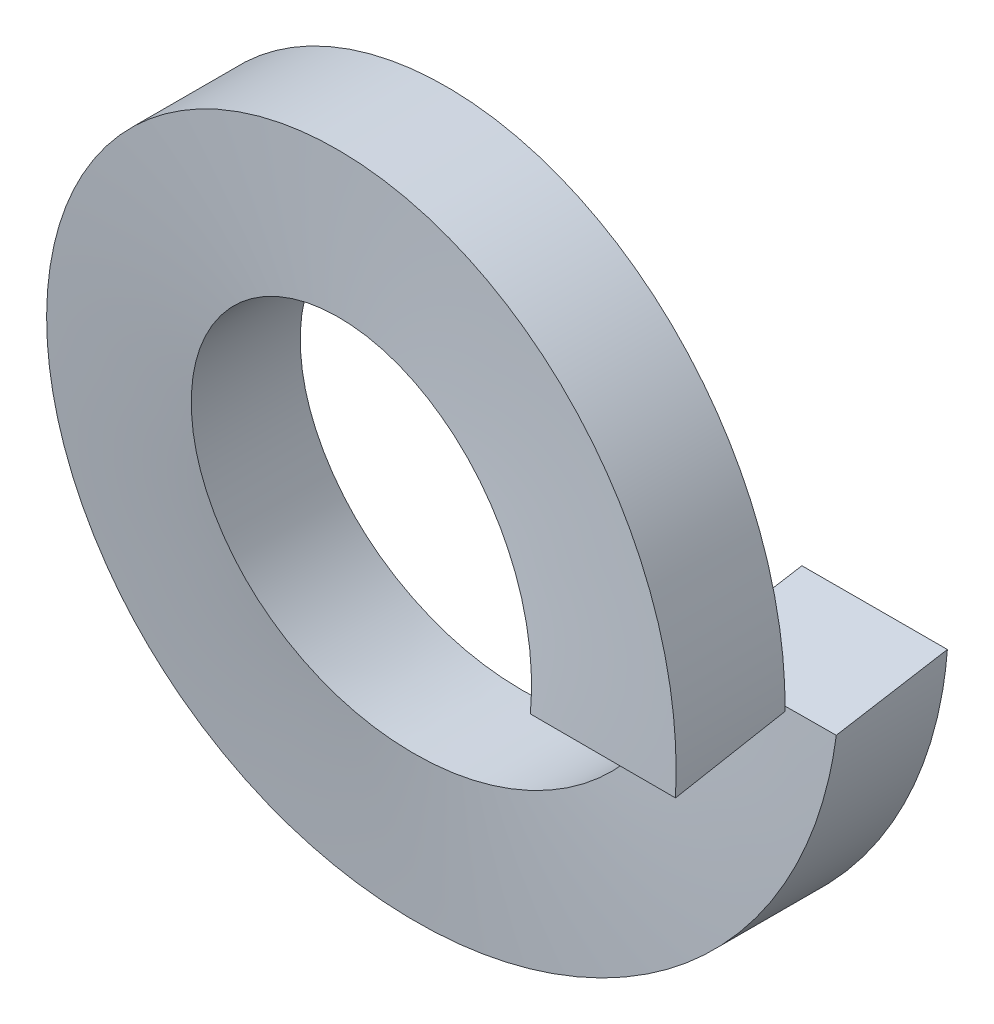
ISO-10303-21;
HEADER;
FILE_DESCRIPTION(('STEP AP214'),'2;1');
FILE_NAME('part.step','',(''),(''),'','','');
FILE_SCHEMA(('AUTOMOTIVE_DESIGN { 1 0 10303 214 1 1 1 1 }'));
ENDSEC;
DATA;
#1=APPLICATION_CONTEXT('core data for automotive mechanical design processes');
#2=APPLICATION_PROTOCOL_DEFINITION('international standard','automotive_design',2000,#1);
#3=PRODUCT_CONTEXT('',#1,'mechanical');
#4=PRODUCT('Part','Part','',(#3));
#5=PRODUCT_RELATED_PRODUCT_CATEGORY('part','',(#4));
#6=PRODUCT_DEFINITION_FORMATION('','',#4);
#7=PRODUCT_DEFINITION_CONTEXT('part definition',#1,'design');
#8=PRODUCT_DEFINITION('design','',#6,#7);
#9=PRODUCT_DEFINITION_SHAPE('','',#8);
#10=(LENGTH_UNIT() NAMED_UNIT(*) SI_UNIT(.MILLI.,.METRE.));
#11=(NAMED_UNIT(*) PLANE_ANGLE_UNIT() SI_UNIT($,.RADIAN.));
#12=(NAMED_UNIT(*) SI_UNIT($,.STERADIAN.) SOLID_ANGLE_UNIT());
#13=UNCERTAINTY_MEASURE_WITH_UNIT(LENGTH_MEASURE(1.E-05),#10,'distance_accuracy_value','');
#14=(GEOMETRIC_REPRESENTATION_CONTEXT(3) GLOBAL_UNCERTAINTY_ASSIGNED_CONTEXT((#13)) GLOBAL_UNIT_ASSIGNED_CONTEXT((#10,
#11,#12)) REPRESENTATION_CONTEXT('',''));
#15=CARTESIAN_POINT('',(0.,0.,0.));
#16=DIRECTION('',(0.,0.,1.));
#17=DIRECTION('',(1.,0.,0.));
#18=AXIS2_PLACEMENT_3D('',#15,#16,#17);
#19=CARTESIAN_POINT('',(5.765,0.,0.749999999999999));
#20=CARTESIAN_POINT('',(5.765,1.54472709436542,0.562499999999999));
#21=CARTESIAN_POINT('',(4.99263645281729,2.8825,0.374999999999999));
#22=CARTESIAN_POINT('',(4.22027290563458,4.22027290563458,0.187499999999999));
#23=CARTESIAN_POINT('',(2.8825,4.99263645281729,0.));
#24=CARTESIAN_POINT('',(1.54472709436542,5.765,-0.187500000000001));
#25=CARTESIAN_POINT('',(0.,5.765,-0.375000000000001));
#26=CARTESIAN_POINT('',(-1.54472709436542,5.765,-0.562500000000001));
#27=CARTESIAN_POINT('',(-2.8825,4.99263645281729,-0.750000000000001));
#28=CARTESIAN_POINT('',(-4.22027290563458,4.22027290563458,-0.937500000000001));
#29=CARTESIAN_POINT('',(-4.99263645281729,2.8825,-1.125));
#30=CARTESIAN_POINT('',(-5.765,1.54472709436542,-1.3125));
#31=CARTESIAN_POINT('',(-5.765,0.,-1.5));
#32=CARTESIAN_POINT('',(-5.765,-1.54472709436542,-1.6875));
#33=CARTESIAN_POINT('',(-4.99263645281729,-2.8825,-1.875));
#34=CARTESIAN_POINT('',(-4.22027290563458,-4.22027290563457,-2.0625));
#35=CARTESIAN_POINT('',(-2.8825,-4.99263645281729,-2.25));
#36=CARTESIAN_POINT('',(-1.54472709436543,-5.765,-2.4375));
#37=CARTESIAN_POINT('',(0.,-5.765,-2.625));
#38=CARTESIAN_POINT('',(1.54472709436542,-5.765,-2.8125));
#39=CARTESIAN_POINT('',(2.8825,-4.99263645281729,-3.));
#40=CARTESIAN_POINT('',(4.22027290563458,-4.22027290563458,-3.1875));
#41=CARTESIAN_POINT('',(4.99263645281729,-2.8825,-3.375));
#42=CARTESIAN_POINT('',(5.765,-1.54472709436543,-3.5625));
#43=CARTESIAN_POINT('',(5.765,0.,-3.75));
#44=CARTESIAN_POINT('',(5.765,0.,3.75));
#45=CARTESIAN_POINT('',(5.765,1.54472709436542,3.5625));
#46=CARTESIAN_POINT('',(4.99263645281729,2.8825,3.375));
#47=CARTESIAN_POINT('',(4.22027290563458,4.22027290563458,3.1875));
#48=CARTESIAN_POINT('',(2.8825,4.99263645281729,3.));
#49=CARTESIAN_POINT('',(1.54472709436542,5.765,2.8125));
#50=CARTESIAN_POINT('',(0.,5.765,2.625));
#51=CARTESIAN_POINT('',(-1.54472709436542,5.765,2.4375));
#52=CARTESIAN_POINT('',(-2.8825,4.99263645281729,2.25));
#53=CARTESIAN_POINT('',(-4.22027290563458,4.22027290563458,2.0625));
#54=CARTESIAN_POINT('',(-4.99263645281729,2.8825,1.875));
#55=CARTESIAN_POINT('',(-5.765,1.54472709436542,1.6875));
#56=CARTESIAN_POINT('',(-5.765,0.,1.5));
#57=CARTESIAN_POINT('',(-5.765,-1.54472709436542,1.3125));
#58=CARTESIAN_POINT('',(-4.99263645281729,-2.8825,1.125));
#59=CARTESIAN_POINT('',(-4.22027290563458,-4.22027290563457,0.9375));
#60=CARTESIAN_POINT('',(-2.8825,-4.99263645281729,0.749999999999999));
#61=CARTESIAN_POINT('',(-1.54472709436543,-5.765,0.562499999999999));
#62=CARTESIAN_POINT('',(0.,-5.765,0.374999999999999));
#63=CARTESIAN_POINT('',(1.54472709436542,-5.765,0.187499999999999));
#64=CARTESIAN_POINT('',(2.8825,-4.99263645281729,0.));
#65=CARTESIAN_POINT('',(4.22027290563458,-4.22027290563458,-0.1875));
#66=CARTESIAN_POINT('',(4.99263645281729,-2.8825,-0.375));
#67=CARTESIAN_POINT('',(5.765,-1.54472709436543,-0.5625));
#68=CARTESIAN_POINT('',(5.765,0.,-0.750000000000001));
#69=(BOUNDED_SURFACE() B_SPLINE_SURFACE(1,2,((#19,#20,#21,#22,#23,#24,#25,#26,#27,#28,#29,#30,
#31,#32,#33,#34,#35,#36,#37,#38,#39,#40,#41,#42,#43),(#44,#45,#46,#47,#48,#49,#50,#51,#52,#53,
#54,#55,#56,#57,#58,#59,#60,#61,#62,#63,#64,#65,#66,#67,#68)),.UNSPECIFIED.,.F.,.F.,
.F.) B_SPLINE_SURFACE_WITH_KNOTS((2,2),(3,2,2,2,2,2,2,2,2,2,2,2,3),(0.,1.),(0.,
0.0833333333333333,0.166666666666667,0.25,0.333333333333333,0.416666666666667,0.5,
0.583333333333333,0.666666666666667,0.75,0.833333333333333,0.916666666666667,1.),
.UNSPECIFIED.) GEOMETRIC_REPRESENTATION_ITEM() RATIONAL_B_SPLINE_SURFACE(((1.,0.965925826289068,
1.,0.965925826289068,1.,0.965925826289068,1.,0.965925826289068,1.,0.965925826289068,1.,
0.965925826289068,1.,0.965925826289068,1.,0.965925826289068,1.,0.965925826289068,1.,
0.965925826289068,1.,0.965925826289068,1.,0.965925826289068,1.),(1.,0.965925826289068,1.,
0.965925826289068,1.,0.965925826289068,1.,0.965925826289068,1.,0.965925826289068,1.,
0.965925826289068,1.,0.965925826289068,1.,0.965925826289068,1.,0.965925826289068,1.,
0.965925826289068,1.,0.965925826289068,1.,0.965925826289068,1.))) REPRESENTATION_ITEM('') SURFACE());
#70=CARTESIAN_POINT('',(5.765,0.,3.75));
#71=CARTESIAN_POINT('',(5.765,1.54472709436542,3.5625));
#72=CARTESIAN_POINT('',(4.99263645281729,2.8825,3.375));
#73=CARTESIAN_POINT('',(4.22027290563458,4.22027290563458,3.1875));
#74=CARTESIAN_POINT('',(2.8825,4.99263645281729,3.));
#75=CARTESIAN_POINT('',(1.54472709436542,5.765,2.8125));
#76=CARTESIAN_POINT('',(0.,5.765,2.625));
#77=CARTESIAN_POINT('',(-1.54472709436542,5.765,2.4375));
#78=CARTESIAN_POINT('',(-2.8825,4.99263645281729,2.25));
#79=CARTESIAN_POINT('',(-4.22027290563458,4.22027290563458,2.0625));
#80=CARTESIAN_POINT('',(-4.99263645281729,2.8825,1.875));
#81=CARTESIAN_POINT('',(-5.765,1.54472709436542,1.6875));
#82=CARTESIAN_POINT('',(-5.765,0.,1.5));
#83=CARTESIAN_POINT('',(-5.765,-1.54472709436542,1.3125));
#84=CARTESIAN_POINT('',(-4.99263645281729,-2.8825,1.125));
#85=CARTESIAN_POINT('',(-4.22027290563458,-4.22027290563457,0.9375));
#86=CARTESIAN_POINT('',(-2.8825,-4.99263645281729,0.749999999999999));
#87=CARTESIAN_POINT('',(-1.54472709436543,-5.765,0.562499999999999));
#88=CARTESIAN_POINT('',(0.,-5.765,0.374999999999999));
#89=CARTESIAN_POINT('',(1.54472709436542,-5.765,0.187499999999999));
#90=CARTESIAN_POINT('',(2.8825,-4.99263645281729,0.));
#91=CARTESIAN_POINT('',(4.22027290563458,-4.22027290563458,-0.1875));
#92=CARTESIAN_POINT('',(4.99263645281729,-2.8825,-0.375));
#93=CARTESIAN_POINT('',(5.765,-1.54472709436543,-0.5625));
#94=CARTESIAN_POINT('',(5.765,0.,-0.750000000000001));
#95=(BOUNDED_CURVE() B_SPLINE_CURVE(2,(#70,#71,#72,#73,#74,#75,#76,#77,#78,#79,#80,#81,#82,#83,
#84,#85,#86,#87,#88,#89,#90,#91,#92,#93,#94),.UNSPECIFIED.,.F.,
.F.) B_SPLINE_CURVE_WITH_KNOTS((3,2,2,2,2,2,2,2,2,2,2,2,3),(0.,0.0833333333333333,
0.166666666666667,0.25,0.333333333333333,0.416666666666667,0.5,0.583333333333333,
0.666666666666667,0.75,0.833333333333333,0.916666666666667,1.),
.UNSPECIFIED.) CURVE() GEOMETRIC_REPRESENTATION_ITEM() RATIONAL_B_SPLINE_CURVE((1.,
0.965925826289068,1.,0.965925826289068,1.,0.965925826289068,1.,0.965925826289068,1.,
0.965925826289068,1.,0.965925826289068,1.,0.965925826289068,1.,0.965925826289068,1.,
0.965925826289068,1.,0.965925826289068,1.,0.965925826289068,1.,0.965925826289068,1.)) REPRESENTATION_ITEM(''));
#96=CARTESIAN_POINT('',(5.76408794042053,0.102543722863248,3.73752351116753));
#97=VERTEX_POINT('',#96);
#98=CARTESIAN_POINT('',(5.72899561014913,-0.643299540565697,-0.670744873382662));
#99=VERTEX_POINT('',#98);
#100=EDGE_CURVE('E95',#97,#99,#95,.T.);
#101=CARTESIAN_POINT('',(5.7289956101492,-0.643299540565049,-0.670744873382743));
#102=CARTESIAN_POINT('',(5.73911074554524,-0.553186752426223,-1.18179989046955));
#103=CARTESIAN_POINT('',(5.74708132428222,-0.463067032184314,-1.69289422146653));
#104=CARTESIAN_POINT('',(5.75584601051134,-0.327878589746962,-2.45958597728393));
#105=CARTESIAN_POINT('',(5.7582357332344,-0.282812919540643,-2.71516609341392));
#106=CARTESIAN_POINT('',(5.7619555391141,-0.192679507763275,-3.22633807296703));
#107=CARTESIAN_POINT('',(5.76328560458463,-0.147611766170208,-3.48192993651502));
#108=CARTESIAN_POINT('',(5.76408794042052,-0.102543722863249,-3.73752351116753));
#109=B_SPLINE_CURVE_WITH_KNOTS('',3,(#101,#102,#103,#104,#105,#106,#107,#108),.UNSPECIFIED.,.F.,
.F.,(4,2,2,4),(0.,1.55710374206691,2.33570326149786,3.11431577579177),.UNSPECIFIED.);
#110=CARTESIAN_POINT('',(5.76408794042052,-0.102543722863246,-3.73752351116753));
#111=VERTEX_POINT('',#110);
#112=EDGE_CURVE('E61',#99,#111,#109,.T.);
#113=CARTESIAN_POINT('',(5.765,0.,0.749999999999999));
#114=CARTESIAN_POINT('',(5.765,1.54472709436542,0.562499999999999));
#115=CARTESIAN_POINT('',(4.99263645281729,2.8825,0.374999999999999));
#116=CARTESIAN_POINT('',(4.22027290563458,4.22027290563458,0.187499999999999));
#117=CARTESIAN_POINT('',(2.8825,4.99263645281729,0.));
#118=CARTESIAN_POINT('',(1.54472709436542,5.765,-0.187500000000001));
#119=CARTESIAN_POINT('',(0.,5.765,-0.375000000000001));
#120=CARTESIAN_POINT('',(-1.54472709436542,5.765,-0.562500000000001));
#121=CARTESIAN_POINT('',(-2.8825,4.99263645281729,-0.750000000000001));
#122=CARTESIAN_POINT('',(-4.22027290563458,4.22027290563458,-0.937500000000001));
#123=CARTESIAN_POINT('',(-4.99263645281729,2.8825,-1.125));
#124=CARTESIAN_POINT('',(-5.765,1.54472709436542,-1.3125));
#125=CARTESIAN_POINT('',(-5.765,0.,-1.5));
#126=CARTESIAN_POINT('',(-5.765,-1.54472709436542,-1.6875));
#127=CARTESIAN_POINT('',(-4.99263645281729,-2.8825,-1.875));
#128=CARTESIAN_POINT('',(-4.22027290563458,-4.22027290563457,-2.0625));
#129=CARTESIAN_POINT('',(-2.8825,-4.99263645281729,-2.25));
#130=CARTESIAN_POINT('',(-1.54472709436543,-5.765,-2.4375));
#131=CARTESIAN_POINT('',(0.,-5.765,-2.625));
#132=CARTESIAN_POINT('',(1.54472709436542,-5.765,-2.8125));
#133=CARTESIAN_POINT('',(2.8825,-4.99263645281729,-3.));
#134=CARTESIAN_POINT('',(4.22027290563458,-4.22027290563458,-3.1875));
#135=CARTESIAN_POINT('',(4.99263645281729,-2.8825,-3.375));
#136=CARTESIAN_POINT('',(5.765,-1.54472709436543,-3.5625));
#137=CARTESIAN_POINT('',(5.765,0.,-3.75));
#138=(BOUNDED_CURVE() B_SPLINE_CURVE(2,(#113,#114,#115,#116,#117,#118,#119,#120,#121,#122,#123,
#124,#125,#126,#127,#128,#129,#130,#131,#132,#133,#134,#135,#136,#137),.UNSPECIFIED.,.F.,
.F.) B_SPLINE_CURVE_WITH_KNOTS((3,2,2,2,2,2,2,2,2,2,2,2,3),(0.,0.0833333333333333,
0.166666666666667,0.25,0.333333333333333,0.416666666666667,0.5,0.583333333333333,
0.666666666666667,0.75,0.833333333333333,0.916666666666667,1.),
.UNSPECIFIED.) CURVE() GEOMETRIC_REPRESENTATION_ITEM() RATIONAL_B_SPLINE_CURVE((1.,
0.965925826289068,1.,0.965925826289068,1.,0.965925826289068,1.,0.965925826289068,1.,
0.965925826289068,1.,0.965925826289068,1.,0.965925826289068,1.,0.965925826289068,1.,
0.965925826289068,1.,0.965925826289068,1.,0.965925826289068,1.,0.965925826289068,1.)) REPRESENTATION_ITEM(''));
#139=CARTESIAN_POINT('',(5.7289956101492,0.64329954056505,0.670744873382741));
#140=VERTEX_POINT('',#139);
#141=EDGE_CURVE('E91',#140,#111,#138,.T.);
#142=CARTESIAN_POINT('',(5.7289956101492,0.64329954056505,0.670744873382741));
#143=CARTESIAN_POINT('',(5.73911074554524,0.553186752426222,1.18179989046955));
#144=CARTESIAN_POINT('',(5.74708132428223,0.463067032184313,1.69289422146653));
#145=CARTESIAN_POINT('',(5.75584601051134,0.327878589746962,2.45958597728393));
#146=CARTESIAN_POINT('',(5.7582357332344,0.282812919540643,2.71516609341392));
#147=CARTESIAN_POINT('',(5.7619555391141,0.192679507763275,3.22633807296703));
#148=CARTESIAN_POINT('',(5.76328560458463,0.147611766170208,3.48192993651502));
#149=CARTESIAN_POINT('',(5.76408794042053,0.102543722863248,3.73752351116753));
#150=B_SPLINE_CURVE_WITH_KNOTS('',3,(#142,#143,#144,#145,#146,#147,#148,#149),.UNSPECIFIED.,.F.,
.F.,(4,2,2,4),(0.,1.55710374206691,2.33570326149787,3.11431577579177),.UNSPECIFIED.);
#151=EDGE_CURVE('E85',#140,#97,#150,.T.);
#152=ORIENTED_EDGE('',*,*,#100,.T.);
#153=ORIENTED_EDGE('',*,*,#112,.T.);
#154=ORIENTED_EDGE('',*,*,#141,.F.);
#155=ORIENTED_EDGE('',*,*,#151,.T.);
#156=EDGE_LOOP('',(#152,#153,#154,#155));
#157=FACE_BOUND('',#156,.T.);
#158=ADVANCED_FACE('F38',(#157),#69,.T.);
#159=CARTESIAN_POINT('',(9.765,0.,0.749999999999998));
#160=CARTESIAN_POINT('',(9.765,2.61652386408991,0.562499999999999));
#161=CARTESIAN_POINT('',(8.45673806795504,4.8825,0.374999999999999));
#162=CARTESIAN_POINT('',(7.14847613591009,7.14847613591009,0.187499999999999));
#163=CARTESIAN_POINT('',(4.8825,8.45673806795504,0.));
#164=CARTESIAN_POINT('',(2.61652386408992,9.765,-0.187500000000001));
#165=CARTESIAN_POINT('',(0.,9.765,-0.375000000000001));
#166=CARTESIAN_POINT('',(-2.61652386408991,9.765,-0.562500000000001));
#167=CARTESIAN_POINT('',(-4.8825,8.45673806795504,-0.750000000000001));
#168=CARTESIAN_POINT('',(-7.14847613591009,7.14847613591009,-0.937500000000001));
#169=CARTESIAN_POINT('',(-8.45673806795504,4.8825,-1.125));
#170=CARTESIAN_POINT('',(-9.765,2.61652386408992,-1.3125));
#171=CARTESIAN_POINT('',(-9.765,0.,-1.5));
#172=CARTESIAN_POINT('',(-9.765,-2.61652386408991,-1.6875));
#173=CARTESIAN_POINT('',(-8.45673806795505,-4.8825,-1.875));
#174=CARTESIAN_POINT('',(-7.14847613591009,-7.14847613591008,-2.0625));
#175=CARTESIAN_POINT('',(-4.8825,-8.45673806795504,-2.25));
#176=CARTESIAN_POINT('',(-2.61652386408992,-9.765,-2.4375));
#177=CARTESIAN_POINT('',(0.,-9.765,-2.625));
#178=CARTESIAN_POINT('',(2.61652386408991,-9.765,-2.8125));
#179=CARTESIAN_POINT('',(4.88249999999999,-8.45673806795505,-3.));
#180=CARTESIAN_POINT('',(7.14847613591009,-7.14847613591009,-3.1875));
#181=CARTESIAN_POINT('',(8.45673806795504,-4.8825,-3.375));
#182=CARTESIAN_POINT('',(9.765,-2.61652386408992,-3.5625));
#183=CARTESIAN_POINT('',(9.765,0.,-3.75));
#184=CARTESIAN_POINT('',(5.765,0.,0.749999999999999));
#185=CARTESIAN_POINT('',(5.765,1.54472709436542,0.562499999999999));
#186=CARTESIAN_POINT('',(4.99263645281729,2.8825,0.374999999999999));
#187=CARTESIAN_POINT('',(4.22027290563458,4.22027290563458,0.187499999999999));
#188=CARTESIAN_POINT('',(2.8825,4.99263645281729,0.));
#189=CARTESIAN_POINT('',(1.54472709436542,5.765,-0.187500000000001));
#190=CARTESIAN_POINT('',(0.,5.765,-0.375000000000001));
#191=CARTESIAN_POINT('',(-1.54472709436542,5.765,-0.562500000000001));
#192=CARTESIAN_POINT('',(-2.8825,4.99263645281729,-0.750000000000001));
#193=CARTESIAN_POINT('',(-4.22027290563458,4.22027290563458,-0.937500000000001));
#194=CARTESIAN_POINT('',(-4.99263645281729,2.8825,-1.125));
#195=CARTESIAN_POINT('',(-5.765,1.54472709436542,-1.3125));
#196=CARTESIAN_POINT('',(-5.765,0.,-1.5));
#197=CARTESIAN_POINT('',(-5.765,-1.54472709436542,-1.6875));
#198=CARTESIAN_POINT('',(-4.99263645281729,-2.8825,-1.875));
#199=CARTESIAN_POINT('',(-4.22027290563458,-4.22027290563457,-2.0625));
#200=CARTESIAN_POINT('',(-2.8825,-4.99263645281729,-2.25));
#201=CARTESIAN_POINT('',(-1.54472709436543,-5.765,-2.4375));
#202=CARTESIAN_POINT('',(0.,-5.765,-2.625));
#203=CARTESIAN_POINT('',(1.54472709436542,-5.765,-2.8125));
#204=CARTESIAN_POINT('',(2.8825,-4.99263645281729,-3.));
#205=CARTESIAN_POINT('',(4.22027290563458,-4.22027290563458,-3.1875));
#206=CARTESIAN_POINT('',(4.99263645281729,-2.8825,-3.375));
#207=CARTESIAN_POINT('',(5.765,-1.54472709436543,-3.5625));
#208=CARTESIAN_POINT('',(5.765,0.,-3.75));
#209=(BOUNDED_SURFACE() B_SPLINE_SURFACE(1,2,((#159,#160,#161,#162,#163,#164,#165,#166,#167,
#168,#169,#170,#171,#172,#173,#174,#175,#176,#177,#178,#179,#180,#181,#182,#183),(#184,#185,
#186,#187,#188,#189,#190,#191,#192,#193,#194,#195,#196,#197,#198,#199,#200,#201,#202,#203,#204,
#205,#206,#207,#208)),.UNSPECIFIED.,.F.,.F.,.F.) B_SPLINE_SURFACE_WITH_KNOTS((2,2),(3,2,2,2,2,2,
2,2,2,2,2,2,3),(0.,1.),(0.,0.0833333333333333,0.166666666666667,0.25,0.333333333333333,
0.416666666666667,0.5,0.583333333333333,0.666666666666667,0.75,0.833333333333333,
0.916666666666667,1.),
.UNSPECIFIED.) GEOMETRIC_REPRESENTATION_ITEM() RATIONAL_B_SPLINE_SURFACE(((1.,0.965925826289068,
1.,0.965925826289068,1.,0.965925826289068,1.,0.965925826289068,1.,0.965925826289068,1.,
0.965925826289068,1.,0.965925826289068,1.,0.965925826289068,1.,0.965925826289068,1.,
0.965925826289068,1.,0.965925826289068,1.,0.965925826289068,1.),(1.,0.965925826289068,1.,
0.965925826289068,1.,0.965925826289068,1.,0.965925826289068,1.,0.965925826289068,1.,
0.965925826289068,1.,0.965925826289068,1.,0.965925826289068,1.,0.965925826289068,1.,
0.965925826289068,1.,0.965925826289068,1.,0.965925826289068,1.))) REPRESENTATION_ITEM('') SURFACE());
#210=CARTESIAN_POINT('',(5.76408794042052,-0.102543722863246,-3.73752351116753));
#211=CARTESIAN_POINT('',(6.10917920907806,-0.102411183395832,-3.73827517983946));
#212=CARTESIAN_POINT('',(6.45427068852115,-0.102298903113385,-3.738911952964));
#213=CARTESIAN_POINT('',(7.14445392468501,-0.102104979729311,-3.7400117471265));
#214=CARTESIAN_POINT('',(7.48954568140577,-0.102023336626527,-3.74047476817103));
#215=CARTESIAN_POINT('',(8.47791525289785,-0.101819227864704,-3.74163232648119));
#216=CARTESIAN_POINT('',(9.12119326451874,-0.101722445481267,-3.74218120665284));
#217=CARTESIAN_POINT('',(9.76447112748242,-0.101629722828469,-3.74270706294792));
#218=B_SPLINE_CURVE_WITH_KNOTS('',3,(#210,#211,#212,#213,#214,#215,#216,#217),.UNSPECIFIED.,.F.,
.F.,(4,2,2,4),(0.,1.03527624369406,2.07055244823791,4.00038695086647),.UNSPECIFIED.);
#219=CARTESIAN_POINT('',(9.76447112748242,-0.101629722828464,-3.74270706294792));
#220=VERTEX_POINT('',#219);
#221=EDGE_CURVE('E178',#111,#220,#218,.T.);
#222=CARTESIAN_POINT('',(9.765,0.,0.749999999999998));
#223=CARTESIAN_POINT('',(9.765,2.61652386408991,0.562499999999999));
#224=CARTESIAN_POINT('',(8.45673806795504,4.8825,0.374999999999999));
#225=CARTESIAN_POINT('',(7.14847613591009,7.14847613591009,0.187499999999999));
#226=CARTESIAN_POINT('',(4.8825,8.45673806795504,0.));
#227=CARTESIAN_POINT('',(2.61652386408992,9.765,-0.187500000000001));
#228=CARTESIAN_POINT('',(0.,9.765,-0.375000000000001));
#229=CARTESIAN_POINT('',(-2.61652386408991,9.765,-0.562500000000001));
#230=CARTESIAN_POINT('',(-4.8825,8.45673806795504,-0.750000000000001));
#231=CARTESIAN_POINT('',(-7.14847613591009,7.14847613591009,-0.937500000000001));
#232=CARTESIAN_POINT('',(-8.45673806795504,4.8825,-1.125));
#233=CARTESIAN_POINT('',(-9.765,2.61652386408992,-1.3125));
#234=CARTESIAN_POINT('',(-9.765,0.,-1.5));
#235=CARTESIAN_POINT('',(-9.765,-2.61652386408991,-1.6875));
#236=CARTESIAN_POINT('',(-8.45673806795505,-4.8825,-1.875));
#237=CARTESIAN_POINT('',(-7.14847613591009,-7.14847613591008,-2.0625));
#238=CARTESIAN_POINT('',(-4.8825,-8.45673806795504,-2.25));
#239=CARTESIAN_POINT('',(-2.61652386408992,-9.765,-2.4375));
#240=CARTESIAN_POINT('',(0.,-9.765,-2.625));
#241=CARTESIAN_POINT('',(2.61652386408991,-9.765,-2.8125));
#242=CARTESIAN_POINT('',(4.88249999999999,-8.45673806795505,-3.));
#243=CARTESIAN_POINT('',(7.14847613591009,-7.14847613591009,-3.1875));
#244=CARTESIAN_POINT('',(8.45673806795504,-4.8825,-3.375));
#245=CARTESIAN_POINT('',(9.765,-2.61652386408992,-3.5625));
#246=CARTESIAN_POINT('',(9.765,0.,-3.75));
#247=(BOUNDED_CURVE() B_SPLINE_CURVE(2,(#222,#223,#224,#225,#226,#227,#228,#229,#230,#231,#232,
#233,#234,#235,#236,#237,#238,#239,#240,#241,#242,#243,#244,#245,#246),.UNSPECIFIED.,.F.,
.F.) B_SPLINE_CURVE_WITH_KNOTS((3,2,2,2,2,2,2,2,2,2,2,2,3),(0.,0.0833333333333333,
0.166666666666667,0.25,0.333333333333333,0.416666666666667,0.5,0.583333333333333,
0.666666666666667,0.75,0.833333333333333,0.916666666666667,1.),
.UNSPECIFIED.) CURVE() GEOMETRIC_REPRESENTATION_ITEM() RATIONAL_B_SPLINE_CURVE((1.,
0.965925826289068,1.,0.965925826289068,1.,0.965925826289068,1.,0.965925826289068,1.,
0.965925826289068,1.,0.965925826289068,1.,0.965925826289068,1.,0.965925826289068,1.,
0.965925826289068,1.,0.965925826289068,1.,0.965925826289068,1.,0.965925826289068,1.)) REPRESENTATION_ITEM(''));
#248=CARTESIAN_POINT('',(9.74417173300026,0.637449792374772,0.703920443943612));
#249=VERTEX_POINT('',#248);
#250=EDGE_CURVE('E101',#249,#220,#247,.T.);
#251=CARTESIAN_POINT('',(9.74417173300026,0.637449792374772,0.703920443943612));
#252=CARTESIAN_POINT('',(9.57162780663771,0.637596304191411,0.703089534141545));
#253=CARTESIAN_POINT('',(9.39908408569134,0.637750459914314,0.702215273592855));
#254=CARTESIAN_POINT('',(9.05399707987069,0.638077469859746,0.700360708034494));
#255=CARTESIAN_POINT('',(8.88145379499694,0.638250324098918,0.69938040293043));
#256=CARTESIAN_POINT('',(8.36382520107485,0.638802050108412,0.696251409243379));
#257=CARTESIAN_POINT('',(8.01874104476286,0.639214085258114,0.693914641789831));
#258=CARTESIAN_POINT('',(7.34954062106316,0.640135363393614,0.68868981384916));
#259=CARTESIAN_POINT('',(7.02542403777875,0.640637180862833,0.685843865559209));
#260=CARTESIAN_POINT('',(6.3772006484642,0.641818490169442,0.679144327565291));
#261=CARTESIAN_POINT('',(6.05309384247328,0.642497982643827,0.675290734248743));
#262=CARTESIAN_POINT('',(5.7289956101492,0.643299540565048,0.670744873382741));
#263=B_SPLINE_CURVE_WITH_KNOTS('',3,(#251,#252,#253,#254,#255,#256,#257,#258,#259,#260,#261,
#262),.UNSPECIFIED.,.F.,.F.,(4,2,2,2,2,4),(0.,0.517637975266658,1.03527641130748,
2.0705529594975,3.04293997889216,4.01533048450823),.UNSPECIFIED.);
#264=EDGE_CURVE('E98',#249,#140,#263,.T.);
#265=ORIENTED_EDGE('',*,*,#141,.T.);
#266=ORIENTED_EDGE('',*,*,#221,.T.);
#267=ORIENTED_EDGE('',*,*,#250,.F.);
#268=ORIENTED_EDGE('',*,*,#264,.T.);
#269=EDGE_LOOP('',(#265,#266,#267,#268));
#270=FACE_BOUND('',#269,.T.);
#271=ADVANCED_FACE('F160',(#270),#209,.T.);
#272=CARTESIAN_POINT('',(9.765,0.,3.75));
#273=CARTESIAN_POINT('',(9.765,2.61652386408991,3.5625));
#274=CARTESIAN_POINT('',(8.45673806795504,4.8825,3.375));
#275=CARTESIAN_POINT('',(7.14847613591009,7.14847613591009,3.1875));
#276=CARTESIAN_POINT('',(4.8825,8.45673806795504,3.));
#277=CARTESIAN_POINT('',(2.61652386408992,9.765,2.8125));
#278=CARTESIAN_POINT('',(0.,9.765,2.625));
#279=CARTESIAN_POINT('',(-2.61652386408991,9.765,2.4375));
#280=CARTESIAN_POINT('',(-4.8825,8.45673806795504,2.25));
#281=CARTESIAN_POINT('',(-7.14847613591009,7.14847613591009,2.0625));
#282=CARTESIAN_POINT('',(-8.45673806795504,4.8825,1.875));
#283=CARTESIAN_POINT('',(-9.765,2.61652386408992,1.6875));
#284=CARTESIAN_POINT('',(-9.765,0.,1.5));
#285=CARTESIAN_POINT('',(-9.765,-2.61652386408991,1.3125));
#286=CARTESIAN_POINT('',(-8.45673806795505,-4.8825,1.125));
#287=CARTESIAN_POINT('',(-7.14847613591009,-7.14847613591008,0.937499999999999));
#288=CARTESIAN_POINT('',(-4.8825,-8.45673806795504,0.749999999999999));
#289=CARTESIAN_POINT('',(-2.61652386408992,-9.765,0.562499999999999));
#290=CARTESIAN_POINT('',(0.,-9.765,0.374999999999999));
#291=CARTESIAN_POINT('',(2.61652386408991,-9.765,0.187499999999999));
#292=CARTESIAN_POINT('',(4.88249999999999,-8.45673806795505,0.));
#293=CARTESIAN_POINT('',(7.14847613591009,-7.14847613591009,-0.187500000000001));
#294=CARTESIAN_POINT('',(8.45673806795504,-4.8825,-0.375000000000001));
#295=CARTESIAN_POINT('',(9.765,-2.61652386408992,-0.562500000000001));
#296=CARTESIAN_POINT('',(9.765,0.,-0.750000000000001));
#297=CARTESIAN_POINT('',(9.765,0.,0.749999999999998));
#298=CARTESIAN_POINT('',(9.765,2.61652386408991,0.562499999999999));
#299=CARTESIAN_POINT('',(8.45673806795504,4.8825,0.374999999999999));
#300=CARTESIAN_POINT('',(7.14847613591009,7.14847613591009,0.187499999999999));
#301=CARTESIAN_POINT('',(4.8825,8.45673806795504,0.));
#302=CARTESIAN_POINT('',(2.61652386408992,9.765,-0.187500000000001));
#303=CARTESIAN_POINT('',(0.,9.765,-0.375000000000001));
#304=CARTESIAN_POINT('',(-2.61652386408991,9.765,-0.562500000000001));
#305=CARTESIAN_POINT('',(-4.8825,8.45673806795504,-0.750000000000001));
#306=CARTESIAN_POINT('',(-7.14847613591009,7.14847613591009,-0.937500000000001));
#307=CARTESIAN_POINT('',(-8.45673806795504,4.8825,-1.125));
#308=CARTESIAN_POINT('',(-9.765,2.61652386408992,-1.3125));
#309=CARTESIAN_POINT('',(-9.765,0.,-1.5));
#310=CARTESIAN_POINT('',(-9.765,-2.61652386408991,-1.6875));
#311=CARTESIAN_POINT('',(-8.45673806795505,-4.8825,-1.875));
#312=CARTESIAN_POINT('',(-7.14847613591009,-7.14847613591008,-2.0625));
#313=CARTESIAN_POINT('',(-4.8825,-8.45673806795504,-2.25));
#314=CARTESIAN_POINT('',(-2.61652386408992,-9.765,-2.4375));
#315=CARTESIAN_POINT('',(0.,-9.765,-2.625));
#316=CARTESIAN_POINT('',(2.61652386408991,-9.765,-2.8125));
#317=CARTESIAN_POINT('',(4.88249999999999,-8.45673806795505,-3.));
#318=CARTESIAN_POINT('',(7.14847613591009,-7.14847613591009,-3.1875));
#319=CARTESIAN_POINT('',(8.45673806795504,-4.8825,-3.375));
#320=CARTESIAN_POINT('',(9.765,-2.61652386408992,-3.5625));
#321=CARTESIAN_POINT('',(9.765,0.,-3.75));
#322=(BOUNDED_SURFACE() B_SPLINE_SURFACE(1,2,((#272,#273,#274,#275,#276,#277,#278,#279,#280,
#281,#282,#283,#284,#285,#286,#287,#288,#289,#290,#291,#292,#293,#294,#295,#296),(#297,#298,
#299,#300,#301,#302,#303,#304,#305,#306,#307,#308,#309,#310,#311,#312,#313,#314,#315,#316,#317,
#318,#319,#320,#321)),.UNSPECIFIED.,.F.,.F.,.F.) B_SPLINE_SURFACE_WITH_KNOTS((2,2),(3,2,2,2,2,2,
2,2,2,2,2,2,3),(0.,1.),(0.,0.0833333333333333,0.166666666666667,0.25,0.333333333333333,
0.416666666666667,0.5,0.583333333333333,0.666666666666667,0.75,0.833333333333333,
0.916666666666667,1.),
.UNSPECIFIED.) GEOMETRIC_REPRESENTATION_ITEM() RATIONAL_B_SPLINE_SURFACE(((1.,0.965925826289068,
1.,0.965925826289068,1.,0.965925826289068,1.,0.965925826289068,1.,0.965925826289068,1.,
0.965925826289068,1.,0.965925826289068,1.,0.965925826289068,1.,0.965925826289068,1.,
0.965925826289068,1.,0.965925826289068,1.,0.965925826289068,1.),(1.,0.965925826289068,1.,
0.965925826289068,1.,0.965925826289068,1.,0.965925826289068,1.,0.965925826289068,1.,
0.965925826289068,1.,0.965925826289068,1.,0.965925826289068,1.,0.965925826289068,1.,
0.965925826289068,1.,0.965925826289068,1.,0.965925826289068,1.))) REPRESENTATION_ITEM('') SURFACE());
#323=CARTESIAN_POINT('',(9.76447112748242,-0.101629722828464,-3.74270706294792));
#324=CARTESIAN_POINT('',(9.76400624431074,-0.146281813473175,-3.48947247306666));
#325=CARTESIAN_POINT('',(9.76323527300232,-0.19093381871582,-3.23623836752458));
#326=CARTESIAN_POINT('',(9.76054150789506,-0.302564110664105,-2.60315152227964));
#327=CARTESIAN_POINT('',(9.75823553867143,-0.369542126023808,-2.22330032145606));
#328=CARTESIAN_POINT('',(9.75224119617684,-0.503497150805322,-1.46360362476619));
#329=CARTESIAN_POINT('',(9.74855280516292,-0.570474160203189,-1.0837581290357));
#330=CARTESIAN_POINT('',(9.74417173300027,-0.637449792374772,-0.703920443943615));
#331=B_SPLINE_CURVE_WITH_KNOTS('',3,(#323,#324,#325,#326,#327,#328,#329,#330),.UNSPECIFIED.,.F.,
.F.,(4,2,2,4),(0.,0.771424659839618,1.92857584237334,3.08574187710809),.UNSPECIFIED.);
#332=CARTESIAN_POINT('',(9.74417173300026,-0.637449792374772,-0.703920443943615));
#333=VERTEX_POINT('',#332);
#334=EDGE_CURVE('E97',#220,#333,#331,.T.);
#335=CARTESIAN_POINT('',(9.765,0.,3.75));
#336=CARTESIAN_POINT('',(9.765,2.61652386408991,3.5625));
#337=CARTESIAN_POINT('',(8.45673806795504,4.8825,3.375));
#338=CARTESIAN_POINT('',(7.14847613591009,7.14847613591009,3.1875));
#339=CARTESIAN_POINT('',(4.8825,8.45673806795504,3.));
#340=CARTESIAN_POINT('',(2.61652386408992,9.765,2.8125));
#341=CARTESIAN_POINT('',(0.,9.765,2.625));
#342=CARTESIAN_POINT('',(-2.61652386408991,9.765,2.4375));
#343=CARTESIAN_POINT('',(-4.8825,8.45673806795504,2.25));
#344=CARTESIAN_POINT('',(-7.14847613591009,7.14847613591009,2.0625));
#345=CARTESIAN_POINT('',(-8.45673806795504,4.8825,1.875));
#346=CARTESIAN_POINT('',(-9.765,2.61652386408992,1.6875));
#347=CARTESIAN_POINT('',(-9.765,0.,1.5));
#348=CARTESIAN_POINT('',(-9.765,-2.61652386408991,1.3125));
#349=CARTESIAN_POINT('',(-8.45673806795505,-4.8825,1.125));
#350=CARTESIAN_POINT('',(-7.14847613591009,-7.14847613591008,0.937499999999999));
#351=CARTESIAN_POINT('',(-4.8825,-8.45673806795504,0.749999999999999));
#352=CARTESIAN_POINT('',(-2.61652386408992,-9.765,0.562499999999999));
#353=CARTESIAN_POINT('',(0.,-9.765,0.374999999999999));
#354=CARTESIAN_POINT('',(2.61652386408991,-9.765,0.187499999999999));
#355=CARTESIAN_POINT('',(4.88249999999999,-8.45673806795505,0.));
#356=CARTESIAN_POINT('',(7.14847613591009,-7.14847613591009,-0.187500000000001));
#357=CARTESIAN_POINT('',(8.45673806795504,-4.8825,-0.375000000000001));
#358=CARTESIAN_POINT('',(9.765,-2.61652386408992,-0.562500000000001));
#359=CARTESIAN_POINT('',(9.765,0.,-0.750000000000001));
#360=(BOUNDED_CURVE() B_SPLINE_CURVE(2,(#335,#336,#337,#338,#339,#340,#341,#342,#343,#344,#345,
#346,#347,#348,#349,#350,#351,#352,#353,#354,#355,#356,#357,#358,#359),.UNSPECIFIED.,.F.,
.F.) B_SPLINE_CURVE_WITH_KNOTS((3,2,2,2,2,2,2,2,2,2,2,2,3),(0.,0.0833333333333333,
0.166666666666667,0.25,0.333333333333333,0.416666666666667,0.5,0.583333333333333,
0.666666666666667,0.75,0.833333333333333,0.916666666666667,1.),
.UNSPECIFIED.) CURVE() GEOMETRIC_REPRESENTATION_ITEM() RATIONAL_B_SPLINE_CURVE((1.,
0.965925826289068,1.,0.965925826289068,1.,0.965925826289068,1.,0.965925826289068,1.,
0.965925826289068,1.,0.965925826289068,1.,0.965925826289068,1.,0.965925826289068,1.,
0.965925826289068,1.,0.965925826289068,1.,0.965925826289068,1.,0.965925826289068,1.)) REPRESENTATION_ITEM(''));
#361=CARTESIAN_POINT('',(9.76447112748242,0.101629722828467,3.74270706294791));
#362=VERTEX_POINT('',#361);
#363=EDGE_CURVE('E102',#362,#333,#360,.T.);
#364=CARTESIAN_POINT('',(9.76447112748242,0.101629722828467,3.74270706294791));
#365=CARTESIAN_POINT('',(9.76400624431074,0.146281813473174,3.48947247306666));
#366=CARTESIAN_POINT('',(9.76323527300232,0.190933818715819,3.23623836752457));
#367=CARTESIAN_POINT('',(9.76054150789506,0.302564110664103,2.60315152227964));
#368=CARTESIAN_POINT('',(9.75823553867143,0.369542126023808,2.22330032145606));
#369=CARTESIAN_POINT('',(9.75224119617684,0.503497150805326,1.46360362476619));
#370=CARTESIAN_POINT('',(9.74855280516292,0.570474160203193,1.08375812903569));
#371=CARTESIAN_POINT('',(9.74417173300027,0.637449792374772,0.703920443943612));
#372=B_SPLINE_CURVE_WITH_KNOTS('',3,(#364,#365,#366,#367,#368,#369,#370,#371),.UNSPECIFIED.,.F.,
.F.,(4,2,2,4),(0.,0.771424659839618,1.92857584237334,3.08574187710808),.UNSPECIFIED.);
#373=EDGE_CURVE('E68',#362,#249,#372,.T.);
#374=ORIENTED_EDGE('',*,*,#250,.T.);
#375=ORIENTED_EDGE('',*,*,#334,.T.);
#376=ORIENTED_EDGE('',*,*,#363,.F.);
#377=ORIENTED_EDGE('',*,*,#373,.T.);
#378=EDGE_LOOP('',(#374,#375,#376,#377));
#379=FACE_BOUND('',#378,.T.);
#380=ADVANCED_FACE('F165',(#379),#322,.T.);
#381=CARTESIAN_POINT('',(5.765,0.,3.75));
#382=CARTESIAN_POINT('',(5.765,1.54472709436542,3.5625));
#383=CARTESIAN_POINT('',(4.99263645281729,2.8825,3.375));
#384=CARTESIAN_POINT('',(4.22027290563458,4.22027290563458,3.1875));
#385=CARTESIAN_POINT('',(2.8825,4.99263645281729,3.));
#386=CARTESIAN_POINT('',(1.54472709436542,5.765,2.8125));
#387=CARTESIAN_POINT('',(0.,5.765,2.625));
#388=CARTESIAN_POINT('',(-1.54472709436542,5.765,2.4375));
#389=CARTESIAN_POINT('',(-2.8825,4.99263645281729,2.25));
#390=CARTESIAN_POINT('',(-4.22027290563458,4.22027290563458,2.0625));
#391=CARTESIAN_POINT('',(-4.99263645281729,2.8825,1.875));
#392=CARTESIAN_POINT('',(-5.765,1.54472709436542,1.6875));
#393=CARTESIAN_POINT('',(-5.765,0.,1.5));
#394=CARTESIAN_POINT('',(-5.765,-1.54472709436542,1.3125));
#395=CARTESIAN_POINT('',(-4.99263645281729,-2.8825,1.125));
#396=CARTESIAN_POINT('',(-4.22027290563458,-4.22027290563457,0.9375));
#397=CARTESIAN_POINT('',(-2.8825,-4.99263645281729,0.749999999999999));
#398=CARTESIAN_POINT('',(-1.54472709436543,-5.765,0.562499999999999));
#399=CARTESIAN_POINT('',(0.,-5.765,0.374999999999999));
#400=CARTESIAN_POINT('',(1.54472709436542,-5.765,0.187499999999999));
#401=CARTESIAN_POINT('',(2.8825,-4.99263645281729,0.));
#402=CARTESIAN_POINT('',(4.22027290563458,-4.22027290563458,-0.1875));
#403=CARTESIAN_POINT('',(4.99263645281729,-2.8825,-0.375));
#404=CARTESIAN_POINT('',(5.765,-1.54472709436543,-0.5625));
#405=CARTESIAN_POINT('',(5.765,0.,-0.750000000000001));
#406=CARTESIAN_POINT('',(9.765,0.,3.75));
#407=CARTESIAN_POINT('',(9.765,2.61652386408991,3.5625));
#408=CARTESIAN_POINT('',(8.45673806795504,4.8825,3.375));
#409=CARTESIAN_POINT('',(7.14847613591009,7.14847613591009,3.1875));
#410=CARTESIAN_POINT('',(4.8825,8.45673806795504,3.));
#411=CARTESIAN_POINT('',(2.61652386408992,9.765,2.8125));
#412=CARTESIAN_POINT('',(0.,9.765,2.625));
#413=CARTESIAN_POINT('',(-2.61652386408991,9.765,2.4375));
#414=CARTESIAN_POINT('',(-4.8825,8.45673806795504,2.25));
#415=CARTESIAN_POINT('',(-7.14847613591009,7.14847613591009,2.0625));
#416=CARTESIAN_POINT('',(-8.45673806795504,4.8825,1.875));
#417=CARTESIAN_POINT('',(-9.765,2.61652386408992,1.6875));
#418=CARTESIAN_POINT('',(-9.765,0.,1.5));
#419=CARTESIAN_POINT('',(-9.765,-2.61652386408991,1.3125));
#420=CARTESIAN_POINT('',(-8.45673806795505,-4.8825,1.125));
#421=CARTESIAN_POINT('',(-7.14847613591009,-7.14847613591008,0.937499999999999));
#422=CARTESIAN_POINT('',(-4.8825,-8.45673806795504,0.749999999999999));
#423=CARTESIAN_POINT('',(-2.61652386408992,-9.765,0.562499999999999));
#424=CARTESIAN_POINT('',(0.,-9.765,0.374999999999999));
#425=CARTESIAN_POINT('',(2.61652386408991,-9.765,0.187499999999999));
#426=CARTESIAN_POINT('',(4.88249999999999,-8.45673806795505,0.));
#427=CARTESIAN_POINT('',(7.14847613591009,-7.14847613591009,-0.187500000000001));
#428=CARTESIAN_POINT('',(8.45673806795504,-4.8825,-0.375000000000001));
#429=CARTESIAN_POINT('',(9.765,-2.61652386408992,-0.562500000000001));
#430=CARTESIAN_POINT('',(9.765,0.,-0.750000000000001));
#431=(BOUNDED_SURFACE() B_SPLINE_SURFACE(1,2,((#381,#382,#383,#384,#385,#386,#387,#388,#389,
#390,#391,#392,#393,#394,#395,#396,#397,#398,#399,#400,#401,#402,#403,#404,#405),(#406,#407,
#408,#409,#410,#411,#412,#413,#414,#415,#416,#417,#418,#419,#420,#421,#422,#423,#424,#425,#426,
#427,#428,#429,#430)),.UNSPECIFIED.,.F.,.F.,.F.) B_SPLINE_SURFACE_WITH_KNOTS((2,2),(3,2,2,2,2,2,
2,2,2,2,2,2,3),(0.,1.),(0.,0.0833333333333333,0.166666666666667,0.25,0.333333333333333,
0.416666666666667,0.5,0.583333333333333,0.666666666666667,0.75,0.833333333333333,
0.916666666666667,1.),
.UNSPECIFIED.) GEOMETRIC_REPRESENTATION_ITEM() RATIONAL_B_SPLINE_SURFACE(((1.,0.965925826289068,
1.,0.965925826289068,1.,0.965925826289068,1.,0.965925826289068,1.,0.965925826289068,1.,
0.965925826289068,1.,0.965925826289068,1.,0.965925826289068,1.,0.965925826289068,1.,
0.965925826289068,1.,0.965925826289068,1.,0.965925826289068,1.),(1.,0.965925826289068,1.,
0.965925826289068,1.,0.965925826289068,1.,0.965925826289068,1.,0.965925826289068,1.,
0.965925826289068,1.,0.965925826289068,1.,0.965925826289068,1.,0.965925826289068,1.,
0.965925826289068,1.,0.965925826289068,1.,0.965925826289068,1.))) REPRESENTATION_ITEM('') SURFACE());
#432=CARTESIAN_POINT('',(9.74417173300026,-0.637449792374772,-0.703920443943615));
#433=CARTESIAN_POINT('',(9.57162780663771,-0.637596304191412,-0.703089534141548));
#434=CARTESIAN_POINT('',(9.39908408569134,-0.637750459914314,-0.702215273592857));
#435=CARTESIAN_POINT('',(9.05399707987069,-0.638077469859744,-0.700360708034497));
#436=CARTESIAN_POINT('',(8.88145379499694,-0.638250324098916,-0.699380402930433));
#437=CARTESIAN_POINT('',(8.36382520107485,-0.638802050108407,-0.696251409243382));
#438=CARTESIAN_POINT('',(8.01874104476286,-0.639214085258111,-0.693914641789834));
#439=CARTESIAN_POINT('',(7.34954062106316,-0.640135363393613,-0.688689813849162));
#440=CARTESIAN_POINT('',(7.02542403777875,-0.640637180862833,-0.685843865559211));
#441=CARTESIAN_POINT('',(6.3772006484642,-0.641818490169441,-0.679144327565293));
#442=CARTESIAN_POINT('',(6.05309384247328,-0.642497982643825,-0.675290734248745));
#443=CARTESIAN_POINT('',(5.7289956101492,-0.643299540565045,-0.670744873382744));
#444=B_SPLINE_CURVE_WITH_KNOTS('',3,(#432,#433,#434,#435,#436,#437,#438,#439,#440,#441,#442,
#443),.UNSPECIFIED.,.F.,.F.,(4,2,2,2,2,4),(0.,0.517637975266658,1.03527641130748,
2.0705529594975,3.04293997889216,4.01533048450823),.UNSPECIFIED.);
#445=EDGE_CURVE('E11',#333,#99,#444,.T.);
#446=CARTESIAN_POINT('',(5.76408794042053,0.102543722863248,3.73752351116753));
#447=CARTESIAN_POINT('',(6.10917920907806,0.102411183395835,3.73827517983945));
#448=CARTESIAN_POINT('',(6.45427068852115,0.102298903113387,3.738911952964));
#449=CARTESIAN_POINT('',(7.14445392468501,0.102104979729313,3.7400117471265));
#450=CARTESIAN_POINT('',(7.48954568140577,0.102023336626527,3.74047476817102));
#451=CARTESIAN_POINT('',(8.47791525289785,0.101819227864703,3.74163232648118));
#452=CARTESIAN_POINT('',(9.12119326451874,0.101722445481264,3.74218120665284));
#453=CARTESIAN_POINT('',(9.76447112748242,0.101629722828467,3.74270706294791));
#454=B_SPLINE_CURVE_WITH_KNOTS('',3,(#446,#447,#448,#449,#450,#451,#452,#453),.UNSPECIFIED.,.F.,
.F.,(4,2,2,4),(0.,1.03527624369406,2.07055244823791,4.00038695086647),.UNSPECIFIED.);
#455=EDGE_CURVE('E54',#97,#362,#454,.T.);
#456=ORIENTED_EDGE('',*,*,#363,.T.);
#457=ORIENTED_EDGE('',*,*,#445,.T.);
#458=ORIENTED_EDGE('',*,*,#100,.F.);
#459=ORIENTED_EDGE('',*,*,#455,.T.);
#460=EDGE_LOOP('',(#456,#457,#458,#459));
#461=FACE_BOUND('',#460,.T.);
#462=ADVANCED_FACE('F100',(#461),#431,.T.);
#463=CARTESIAN_POINT('',(9.765,-0.560882396399157,7.5));
#464=DIRECTION('',(0.,-0.984807753012208,-0.173648177666928));
#465=DIRECTION('',(0.,0.173648177666928,-0.984807753012209));
#466=AXIS2_PLACEMENT_3D('',#463,#464,#465);
#467=PLANE('',#466);
#468=ORIENTED_EDGE('',*,*,#264,.F.);
#469=ORIENTED_EDGE('',*,*,#373,.F.);
#470=ORIENTED_EDGE('',*,*,#455,.F.);
#471=ORIENTED_EDGE('',*,*,#151,.F.);
#472=EDGE_LOOP('',(#468,#469,#470,#471));
#473=FACE_BOUND('',#472,.T.);
#474=ADVANCED_FACE('F84',(#473),#467,.T.);
#475=CARTESIAN_POINT('',(9.765,-2.03809402591747,7.23952773349961));
#476=DIRECTION('',(0.,0.984807753012208,0.173648177666928));
#477=DIRECTION('',(0.,-0.173648177666928,0.984807753012209));
#478=AXIS2_PLACEMENT_3D('',#475,#476,#477);
#479=PLANE('',#478);
#480=ORIENTED_EDGE('',*,*,#445,.F.);
#481=ORIENTED_EDGE('',*,*,#334,.F.);
#482=ORIENTED_EDGE('',*,*,#221,.F.);
#483=ORIENTED_EDGE('',*,*,#112,.F.);
#484=EDGE_LOOP('',(#480,#481,#482,#483));
#485=FACE_BOUND('',#484,.T.);
#486=ADVANCED_FACE('F140',(#485),#479,.T.);
#487=CLOSED_SHELL('',(#158,#271,#380,#462,#474,#486));
#488=MANIFOLD_SOLID_BREP('B2',#487);
#489=ADVANCED_BREP_SHAPE_REPRESENTATION('',(#18,#488),#14);
#490=SHAPE_DEFINITION_REPRESENTATION(#9,#489);
ENDSEC;
END-ISO-10303-21;
